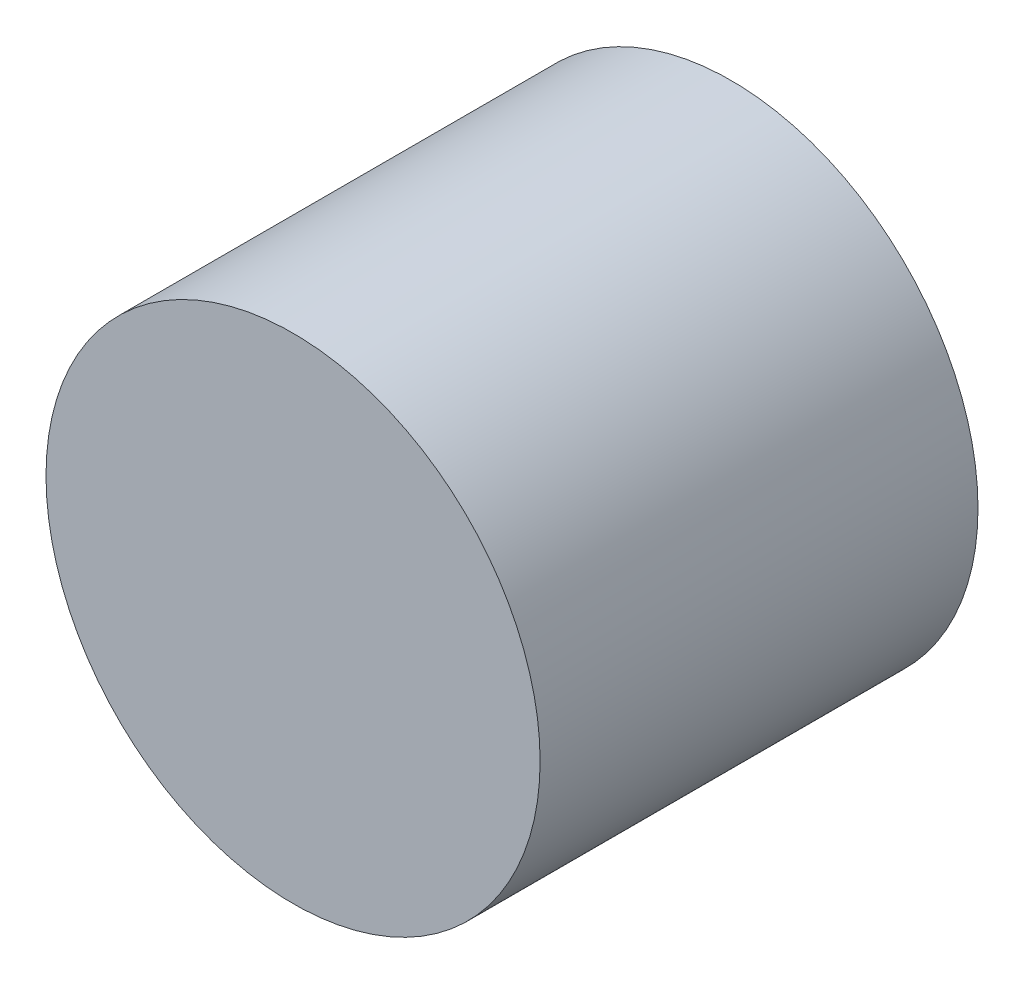
ISO-10303-21;
HEADER;
FILE_DESCRIPTION(('STEP AP214'),'2;1');
FILE_NAME('part.step','',(''),(''),'','','');
FILE_SCHEMA(('AUTOMOTIVE_DESIGN { 1 0 10303 214 1 1 1 1 }'));
ENDSEC;
DATA;
#1=APPLICATION_CONTEXT('core data for automotive mechanical design processes');
#2=APPLICATION_PROTOCOL_DEFINITION('international standard','automotive_design',2000,#1);
#3=PRODUCT_CONTEXT('',#1,'mechanical');
#4=PRODUCT('Part','Part','',(#3));
#5=PRODUCT_RELATED_PRODUCT_CATEGORY('part','',(#4));
#6=PRODUCT_DEFINITION_FORMATION('','',#4);
#7=PRODUCT_DEFINITION_CONTEXT('part definition',#1,'design');
#8=PRODUCT_DEFINITION('design','',#6,#7);
#9=PRODUCT_DEFINITION_SHAPE('','',#8);
#10=(LENGTH_UNIT() NAMED_UNIT(*) SI_UNIT(.MILLI.,.METRE.));
#11=(NAMED_UNIT(*) PLANE_ANGLE_UNIT() SI_UNIT($,.RADIAN.));
#12=(NAMED_UNIT(*) SI_UNIT($,.STERADIAN.) SOLID_ANGLE_UNIT());
#13=UNCERTAINTY_MEASURE_WITH_UNIT(LENGTH_MEASURE(1.E-05),#10,'distance_accuracy_value','');
#14=(GEOMETRIC_REPRESENTATION_CONTEXT(3) GLOBAL_UNCERTAINTY_ASSIGNED_CONTEXT((#13)) GLOBAL_UNIT_ASSIGNED_CONTEXT((#10,
#11,#12)) REPRESENTATION_CONTEXT('',''));
#15=CARTESIAN_POINT('',(0.,0.,0.));
#16=DIRECTION('',(0.,0.,1.));
#17=DIRECTION('',(1.,0.,0.));
#18=AXIS2_PLACEMENT_3D('',#15,#16,#17);
#19=CARTESIAN_POINT('',(0.,0.,22.352));
#20=DIRECTION('',(0.,0.,-1.));
#21=DIRECTION('',(-1.,0.,0.));
#22=AXIS2_PLACEMENT_3D('',#19,#20,#21);
#23=CYLINDRICAL_SURFACE('',#22,12.6111);
#24=CARTESIAN_POINT('',(0.,0.,22.352));
#25=DIRECTION('',(0.,0.,1.));
#26=DIRECTION('',(1.,0.,0.));
#27=AXIS2_PLACEMENT_3D('',#24,#25,#26);
#28=CIRCLE('',#27,12.6111);
#29=CARTESIAN_POINT('',(12.6111,0.,22.352));
#30=VERTEX_POINT('',#29);
#31=EDGE_CURVE('E10',#30,#30,#28,.T.);
#32=ORIENTED_EDGE('',*,*,#31,.F.);
#33=EDGE_LOOP('',(#32));
#34=FACE_BOUND('',#33,.T.);
#35=CARTESIAN_POINT('',(0.,0.,0.));
#36=DIRECTION('',(0.,0.,1.));
#37=DIRECTION('',(1.,0.,0.));
#38=AXIS2_PLACEMENT_3D('',#35,#36,#37);
#39=CIRCLE('',#38,12.6111);
#40=CARTESIAN_POINT('',(12.6111,0.,0.));
#41=VERTEX_POINT('',#40);
#42=EDGE_CURVE('E46',#41,#41,#39,.T.);
#43=ORIENTED_EDGE('',*,*,#42,.T.);
#44=EDGE_LOOP('',(#43));
#45=FACE_BOUND('',#44,.T.);
#46=ADVANCED_FACE('F43',(#34,#45),#23,.T.);
#47=CARTESIAN_POINT('',(0.,0.,22.352));
#48=DIRECTION('',(0.,0.,1.));
#49=DIRECTION('',(1.,0.,0.));
#50=AXIS2_PLACEMENT_3D('',#47,#48,#49);
#51=PLANE('',#50);
#52=ORIENTED_EDGE('',*,*,#31,.T.);
#53=EDGE_LOOP('',(#52));
#54=FACE_BOUND('',#53,.T.);
#55=ADVANCED_FACE('F60',(#54),#51,.T.);
#56=CARTESIAN_POINT('',(0.,0.,0.));
#57=DIRECTION('',(0.,0.,1.));
#58=DIRECTION('',(1.,0.,0.));
#59=AXIS2_PLACEMENT_3D('',#56,#57,#58);
#60=PLANE('',#59);
#61=ORIENTED_EDGE('',*,*,#42,.F.);
#62=EDGE_LOOP('',(#61));
#63=FACE_BOUND('',#62,.T.);
#64=ADVANCED_FACE('F58',(#63),#60,.F.);
#65=CLOSED_SHELL('',(#46,#55,#64));
#66=MANIFOLD_SOLID_BREP('B2',#65);
#67=ADVANCED_BREP_SHAPE_REPRESENTATION('',(#18,#66),#14);
#68=SHAPE_DEFINITION_REPRESENTATION(#9,#67);
ENDSEC;
END-ISO-10303-21;
